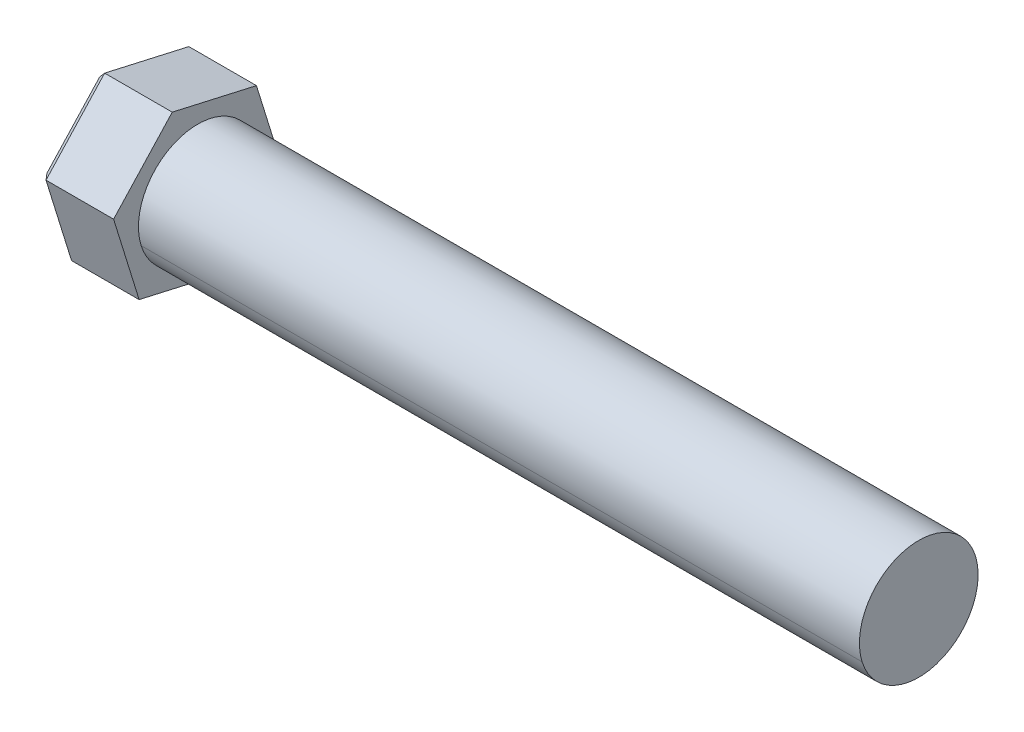
ISO-10303-21;
HEADER;
FILE_DESCRIPTION(('STEP AP214'),'2;1');
FILE_NAME('part.step','',(''),(''),'','','');
FILE_SCHEMA(('AUTOMOTIVE_DESIGN { 1 0 10303 214 1 1 1 1 }'));
ENDSEC;
DATA;
#1=APPLICATION_CONTEXT('core data for automotive mechanical design processes');
#2=APPLICATION_PROTOCOL_DEFINITION('international standard','automotive_design',2000,#1);
#3=PRODUCT_CONTEXT('',#1,'mechanical');
#4=PRODUCT('Part','Part','',(#3));
#5=PRODUCT_RELATED_PRODUCT_CATEGORY('part','',(#4));
#6=PRODUCT_DEFINITION_FORMATION('','',#4);
#7=PRODUCT_DEFINITION_CONTEXT('part definition',#1,'design');
#8=PRODUCT_DEFINITION('design','',#6,#7);
#9=PRODUCT_DEFINITION_SHAPE('','',#8);
#10=(LENGTH_UNIT() NAMED_UNIT(*) SI_UNIT(.MILLI.,.METRE.));
#11=(NAMED_UNIT(*) PLANE_ANGLE_UNIT() SI_UNIT($,.RADIAN.));
#12=(NAMED_UNIT(*) SI_UNIT($,.STERADIAN.) SOLID_ANGLE_UNIT());
#13=UNCERTAINTY_MEASURE_WITH_UNIT(LENGTH_MEASURE(1.E-05),#10,'distance_accuracy_value','');
#14=(GEOMETRIC_REPRESENTATION_CONTEXT(3) GLOBAL_UNCERTAINTY_ASSIGNED_CONTEXT((#13)) GLOBAL_UNIT_ASSIGNED_CONTEXT((#10,
#11,#12)) REPRESENTATION_CONTEXT('',''));
#15=CARTESIAN_POINT('',(0.,0.,0.));
#16=DIRECTION('',(0.,0.,1.));
#17=DIRECTION('',(1.,0.,0.));
#18=AXIS2_PLACEMENT_3D('',#15,#16,#17);
#19=CARTESIAN_POINT('',(-26.156988266467,-27.9977901596134,38.109837238925));
#20=DIRECTION('',(0.707106781186544,-0.689561283995948,0.156541482086585));
#21=DIRECTION('',(0.,-0.221383087040832,-0.97518691991447));
#22=AXIS2_PLACEMENT_3D('',#19,#20,#21);
#23=PLANE('',#22);
#24=DIRECTION('',(0.65465367070798,0.722084638574955,0.22365675970702));
#25=VECTOR('',#24,1.);
#26=CARTESIAN_POINT('',(-26.7966473512185,-28.1310269319542,40.4123090940544));
#27=LINE('',#26,#25);
#28=CARTESIAN_POINT('',(-26.156988266467,-27.4254813592478,40.6308430832672));
#29=VERTEX_POINT('',#28);
#30=CARTESIAN_POINT('',(-25.656988266467,-26.8739801068421,40.8016637551083));
#31=VERTEX_POINT('',#30);
#32=EDGE_CURVE('E25',#29,#31,#27,.T.);
#33=ORIENTED_EDGE('',*,*,#32,.T.);
#34=DIRECTION('',(0.,0.221383087040832,0.97518691991447));
#35=VECTOR('',#34,1.);
#36=CARTESIAN_POINT('',(-25.656988266467,-26.8739801068421,40.8016637551083));
#37=LINE('',#36,#35);
#38=CARTESIAN_POINT('',(-25.656988266467,-28.1464132924702,35.1966276357009));
#39=VERTEX_POINT('',#38);
#40=EDGE_CURVE('E219',#39,#31,#37,.T.);
#41=ORIENTED_EDGE('',*,*,#40,.F.);
#42=DIRECTION('',(-0.654653670707981,-0.554734754921868,0.513515260834907));
#43=VECTOR('',#42,1.);
#44=CARTESIAN_POINT('',(-26.7966473512185,-29.1121277325809,36.0905847894676));
#45=LINE('',#44,#43);
#46=CARTESIAN_POINT('',(-26.156988266467,-28.570098959979,35.5888313945827));
#47=VERTEX_POINT('',#46);
#48=EDGE_CURVE('E11',#39,#47,#45,.T.);
#49=ORIENTED_EDGE('',*,*,#48,.T.);
#50=DIRECTION('',(0.,-0.221383087040832,-0.97518691991447));
#51=VECTOR('',#50,1.);
#52=CARTESIAN_POINT('',(-26.156988266467,-27.9977901596134,38.109837238925));
#53=LINE('',#52,#51);
#54=EDGE_CURVE('E230',#29,#47,#53,.T.);
#55=ORIENTED_EDGE('',*,*,#54,.F.);
#56=EDGE_LOOP('',(#33,#41,#49,#55));
#57=FACE_BOUND('',#56,.T.);
#58=ADVANCED_FACE('F17',(#57),#23,.F.);
#59=CARTESIAN_POINT('',(-26.156988266467,-31.0395084644512,34.8239624323376));
#60=DIRECTION('',(0.707106781186544,-0.209211741764925,0.675448330449999));
#61=DIRECTION('',(0.,-0.955228189604648,-0.295870082611653));
#62=AXIS2_PLACEMENT_3D('',#59,#60,#61);
#63=PLANE('',#62);
#64=DIRECTION('',(-0.65465367070798,0.167349883653089,0.737172020541926));
#65=VECTOR('',#64,1.);
#66=CARTESIAN_POINT('',(-26.7966473512185,-33.345401168819,34.7793808541903));
#67=LINE('',#66,#65);
#68=CARTESIAN_POINT('',(-25.656988266467,-33.6367335538205,33.4960690393697));
#69=VERTEX_POINT('',#68);
#70=CARTESIAN_POINT('',(-26.156988266467,-33.5089179689234,34.0590934700924));
#71=VERTEX_POINT('',#70);
#72=EDGE_CURVE('E257',#69,#71,#67,.T.);
#73=ORIENTED_EDGE('',*,*,#72,.T.);
#74=DIRECTION('',(0.,-0.955228189604648,-0.295870082611653));
#75=VECTOR('',#74,1.);
#76=CARTESIAN_POINT('',(-26.156988266467,-31.0395084644512,34.8239624323376));
#77=LINE('',#76,#75);
#78=EDGE_CURVE('E234',#47,#71,#77,.T.);
#79=ORIENTED_EDGE('',*,*,#78,.F.);
#80=ORIENTED_EDGE('',*,*,#48,.F.);
#81=DIRECTION('',(0.,0.955228189604648,0.295870082611653));
#82=VECTOR('',#81,1.);
#83=CARTESIAN_POINT('',(-25.656988266467,-28.1464132924702,35.1966276357009));
#84=LINE('',#83,#82);
#85=EDGE_CURVE('E208',#69,#39,#84,.T.);
#86=ORIENTED_EDGE('',*,*,#85,.F.);
#87=EDGE_LOOP('',(#73,#79,#80,#86));
#88=FACE_BOUND('',#87,.T.);
#89=ADVANCED_FACE('F287',(#88),#63,.F.);
#90=CARTESIAN_POINT('',(-26.156988266467,-29.3225820633544,42.3869799653644));
#91=DIRECTION('',(0.707106781186545,-0.480349542231022,-0.518906848363414));
#92=DIRECTION('',(0.,-0.733845102563816,0.679316837302817));
#93=AXIS2_PLACEMENT_3D('',#90,#91,#92);
#94=PLANE('',#93);
#95=DIRECTION('',(0.65465367070798,0.167349883653088,0.737172020541926));
#96=VECTOR('',#95,1.);
#97=CARTESIAN_POINT('',(-26.7966473512185,-31.3831995675656,43.4228294633637));
#98=LINE('',#97,#96);
#99=CARTESIAN_POINT('',(-26.156988266467,-31.2196827674611,44.1431168474615));
#100=VERTEX_POINT('',#99);
#101=CARTESIAN_POINT('',(-25.656988266467,-31.091867182564,44.7061412781843));
#102=VERTEX_POINT('',#101);
#103=EDGE_CURVE('E254',#100,#102,#98,.T.);
#104=ORIENTED_EDGE('',*,*,#103,.T.);
#105=DIRECTION('',(0.,-0.733845102563816,0.679316837302817));
#106=VECTOR('',#105,1.);
#107=CARTESIAN_POINT('',(-25.656988266467,-31.091867182564,44.7061412781843));
#108=LINE('',#107,#106);
#109=EDGE_CURVE('E158',#31,#102,#108,.T.);
#110=ORIENTED_EDGE('',*,*,#109,.F.);
#111=ORIENTED_EDGE('',*,*,#32,.F.);
#112=DIRECTION('',(0.,0.733845102563816,-0.679316837302817));
#113=VECTOR('',#112,1.);
#114=CARTESIAN_POINT('',(-26.156988266467,-29.3225820633544,42.3869799653644));
#115=LINE('',#114,#113);
#116=EDGE_CURVE('E226',#100,#29,#115,.T.);
#117=ORIENTED_EDGE('',*,*,#116,.F.);
#118=EDGE_LOOP('',(#104,#110,#111,#117));
#119=FACE_BOUND('',#118,.T.);
#120=ADVANCED_FACE('F271',(#119),#94,.F.);
#121=CARTESIAN_POINT('',(-26.156988266467,-35.4060186730301,35.8152303521896));
#122=DIRECTION('',(0.707106781186545,0.480349542231022,0.518906848363414));
#123=DIRECTION('',(0.,-0.733845102563817,0.679316837302817));
#124=AXIS2_PLACEMENT_3D('',#121,#122,#123);
#125=PLANE('',#124);
#126=DIRECTION('',(-0.65465367070798,0.722084638574956,0.22365675970702));
#127=VECTOR('',#126,1.);
#128=CARTESIAN_POINT('',(-26.7966473512185,-36.5975738044303,37.7899012234996));
#129=LINE('',#128,#127);
#130=CARTESIAN_POINT('',(-25.656988266467,-37.8546206295425,37.4005465624457));
#131=VERTEX_POINT('',#130);
#132=CARTESIAN_POINT('',(-26.156988266467,-37.3031193771367,37.5713672342867));
#133=VERTEX_POINT('',#132);
#134=EDGE_CURVE('E46',#131,#133,#129,.T.);
#135=ORIENTED_EDGE('',*,*,#134,.T.);
#136=DIRECTION('',(0.,-0.733845102563816,0.679316837302817));
#137=VECTOR('',#136,1.);
#138=CARTESIAN_POINT('',(-26.156988266467,-35.4060186730301,35.8152303521896));
#139=LINE('',#138,#137);
#140=EDGE_CURVE('E238',#71,#133,#139,.T.);
#141=ORIENTED_EDGE('',*,*,#140,.F.);
#142=ORIENTED_EDGE('',*,*,#72,.F.);
#143=DIRECTION('',(0.,0.733845102563817,-0.679316837302817));
#144=VECTOR('',#143,1.);
#145=CARTESIAN_POINT('',(-25.656988266467,-33.6367335538205,33.4960690393697));
#146=LINE('',#145,#144);
#147=EDGE_CURVE('E197',#131,#69,#146,.T.);
#148=ORIENTED_EDGE('',*,*,#147,.F.);
#149=EDGE_LOOP('',(#135,#141,#142,#148));
#150=FACE_BOUND('',#149,.T.);
#151=ADVANCED_FACE('F300',(#150),#125,.F.);
#152=CARTESIAN_POINT('',(-26.156988266467,-33.6890922719333,43.3782478852163));
#153=DIRECTION('',(0.707106781186545,0.209211741764925,-0.675448330449999));
#154=DIRECTION('',(0.,-0.955228189604648,-0.295870082611653));
#155=AXIS2_PLACEMENT_3D('',#152,#153,#154);
#156=PLANE('',#155);
#157=DIRECTION('',(0.65465367070798,-0.554734754921869,0.513515260834906));
#158=VECTOR('',#157,1.);
#159=CARTESIAN_POINT('',(-26.7966473512185,-35.6164730038037,42.1116255280863));
#160=LINE('',#159,#158);
#161=CARTESIAN_POINT('',(-26.156988266467,-36.1585017764055,42.6133789229713));
#162=VERTEX_POINT('',#161);
#163=CARTESIAN_POINT('',(-25.656988266467,-36.5821874439143,43.0055826818531));
#164=VERTEX_POINT('',#163);
#165=EDGE_CURVE('E36',#162,#164,#160,.T.);
#166=ORIENTED_EDGE('',*,*,#165,.T.);
#167=DIRECTION('',(0.,-0.955228189604648,-0.295870082611653));
#168=VECTOR('',#167,1.);
#169=CARTESIAN_POINT('',(-25.656988266467,-36.5821874439143,43.0055826818531));
#170=LINE('',#169,#168);
#171=EDGE_CURVE('E165',#102,#164,#170,.T.);
#172=ORIENTED_EDGE('',*,*,#171,.F.);
#173=ORIENTED_EDGE('',*,*,#103,.F.);
#174=DIRECTION('',(0.,0.955228189604648,0.295870082611653));
#175=VECTOR('',#174,1.);
#176=CARTESIAN_POINT('',(-26.156988266467,-33.6890922719333,43.3782478852163));
#177=LINE('',#176,#175);
#178=EDGE_CURVE('E246',#162,#100,#177,.T.);
#179=ORIENTED_EDGE('',*,*,#178,.F.);
#180=EDGE_LOOP('',(#166,#172,#173,#179));
#181=FACE_BOUND('',#180,.T.);
#182=ADVANCED_FACE('F292',(#181),#156,.F.);
#183=CARTESIAN_POINT('',(-26.156988266467,-36.7308105767711,40.092373078629));
#184=DIRECTION('',(0.707106781186545,0.689561283995947,-0.156541482086584));
#185=DIRECTION('',(0.,-0.221383087040832,-0.97518691991447));
#186=AXIS2_PLACEMENT_3D('',#183,#184,#185);
#187=PLANE('',#186);
#188=ORIENTED_EDGE('',*,*,#134,.F.);
#189=DIRECTION('',(0.,-0.221383087040832,-0.97518691991447));
#190=VECTOR('',#189,1.);
#191=CARTESIAN_POINT('',(-25.656988266467,-37.8546206295425,37.4005465624457));
#192=LINE('',#191,#190);
#193=EDGE_CURVE('E186',#164,#131,#192,.T.);
#194=ORIENTED_EDGE('',*,*,#193,.F.);
#195=ORIENTED_EDGE('',*,*,#165,.F.);
#196=DIRECTION('',(0.,0.221383087040832,0.97518691991447));
#197=VECTOR('',#196,1.);
#198=CARTESIAN_POINT('',(-26.156988266467,-36.7308105767711,40.092373078629));
#199=LINE('',#198,#197);
#200=EDGE_CURVE('E242',#133,#162,#199,.T.);
#201=ORIENTED_EDGE('',*,*,#200,.F.);
#202=EDGE_LOOP('',(#188,#194,#195,#201));
#203=FACE_BOUND('',#202,.T.);
#204=ADVANCED_FACE('F308',(#203),#187,.F.);
#205=CARTESIAN_POINT('',(-26.156988266467,-32.3643003681923,39.101105158777));
#206=DIRECTION('',(-1.,0.,0.));
#207=DIRECTION('',(0.,0.,1.));
#208=AXIS2_PLACEMENT_3D('',#205,#206,#207);
#209=PLANE('',#208);
#210=ORIENTED_EDGE('',*,*,#116,.T.);
#211=ORIENTED_EDGE('',*,*,#54,.T.);
#212=ORIENTED_EDGE('',*,*,#78,.T.);
#213=ORIENTED_EDGE('',*,*,#140,.T.);
#214=ORIENTED_EDGE('',*,*,#200,.T.);
#215=ORIENTED_EDGE('',*,*,#178,.T.);
#216=EDGE_LOOP('',(#210,#211,#212,#213,#214,#215));
#217=FACE_BOUND('',#216,.T.);
#218=ADVANCED_FACE('F290',(#217),#209,.T.);
#219=CARTESIAN_POINT('',(-21.156988266467,-32.3643003681923,39.101105158777));
#220=DIRECTION('',(-1.,0.,0.));
#221=DIRECTION('',(0.,0.,1.));
#222=AXIS2_PLACEMENT_3D('',#219,#220,#221);
#223=PLANE('',#222);
#224=CARTESIAN_POINT('',(-21.156988266467,-32.3643003681923,39.101105158777));
#225=DIRECTION('',(-1.,0.,0.));
#226=DIRECTION('',(0.,-0.295870082611653,0.955228189604648));
#227=AXIS2_PLACEMENT_3D('',#224,#225,#226);
#228=CIRCLE('',#227,3.95);
#229=CARTESIAN_POINT('',(-21.156988266467,-31.1956135418762,35.3279538098386));
#230=VERTEX_POINT('',#229);
#231=CARTESIAN_POINT('',(-21.156988266467,-33.5329871945083,42.8742565077154));
#232=VERTEX_POINT('',#231);
#233=EDGE_CURVE('E126',#230,#232,#228,.T.);
#234=ORIENTED_EDGE('',*,*,#233,.T.);
#235=CARTESIAN_POINT('',(-21.156988266467,-32.3643003681923,39.101105158777));
#236=DIRECTION('',(-1.,0.,0.));
#237=DIRECTION('',(0.,-0.295870082611653,0.955228189604648));
#238=AXIS2_PLACEMENT_3D('',#235,#236,#237);
#239=CIRCLE('',#238,3.95);
#240=EDGE_CURVE('E131',#232,#230,#239,.T.);
#241=ORIENTED_EDGE('',*,*,#240,.T.);
#242=EDGE_LOOP('',(#234,#241));
#243=FACE_BOUND('',#242,.T.);
#244=DIRECTION('',(0.,0.733845102563816,-0.679316837302817));
#245=VECTOR('',#244,1.);
#246=CARTESIAN_POINT('',(-21.156988266467,-31.091867182564,44.7061412781843));
#247=LINE('',#246,#245);
#248=CARTESIAN_POINT('',(-21.156988266467,-31.091867182564,44.7061412781843));
#249=VERTEX_POINT('',#248);
#250=CARTESIAN_POINT('',(-21.156988266467,-26.8739801068421,40.8016637551083));
#251=VERTEX_POINT('',#250);
#252=EDGE_CURVE('E157',#249,#251,#247,.T.);
#253=ORIENTED_EDGE('',*,*,#252,.F.);
#254=DIRECTION('',(0.,0.955228189604648,0.295870082611653));
#255=VECTOR('',#254,1.);
#256=CARTESIAN_POINT('',(-21.156988266467,-36.5821874439143,43.0055826818531));
#257=LINE('',#256,#255);
#258=CARTESIAN_POINT('',(-21.156988266467,-36.5821874439143,43.0055826818531));
#259=VERTEX_POINT('',#258);
#260=EDGE_CURVE('E173',#259,#249,#257,.T.);
#261=ORIENTED_EDGE('',*,*,#260,.F.);
#262=DIRECTION('',(0.,0.221383087040832,0.97518691991447));
#263=VECTOR('',#262,1.);
#264=CARTESIAN_POINT('',(-21.156988266467,-37.8546206295425,37.4005465624457));
#265=LINE('',#264,#263);
#266=CARTESIAN_POINT('',(-21.156988266467,-37.8546206295425,37.4005465624457));
#267=VERTEX_POINT('',#266);
#268=EDGE_CURVE('E194',#267,#259,#265,.T.);
#269=ORIENTED_EDGE('',*,*,#268,.F.);
#270=DIRECTION('',(0.,-0.733845102563816,0.679316837302817));
#271=VECTOR('',#270,1.);
#272=CARTESIAN_POINT('',(-21.156988266467,-33.6367335538205,33.4960690393697));
#273=LINE('',#272,#271);
#274=CARTESIAN_POINT('',(-21.156988266467,-33.6367335538205,33.4960690393697));
#275=VERTEX_POINT('',#274);
#276=EDGE_CURVE('E205',#275,#267,#273,.T.);
#277=ORIENTED_EDGE('',*,*,#276,.F.);
#278=DIRECTION('',(0.,-0.955228189604648,-0.295870082611653));
#279=VECTOR('',#278,1.);
#280=CARTESIAN_POINT('',(-21.156988266467,-28.1464132924702,35.1966276357009));
#281=LINE('',#280,#279);
#282=CARTESIAN_POINT('',(-21.156988266467,-28.1464132924702,35.1966276357009));
#283=VERTEX_POINT('',#282);
#284=EDGE_CURVE('E216',#283,#275,#281,.T.);
#285=ORIENTED_EDGE('',*,*,#284,.F.);
#286=DIRECTION('',(0.,-0.221383087040832,-0.97518691991447));
#287=VECTOR('',#286,1.);
#288=CARTESIAN_POINT('',(-21.156988266467,-26.8739801068421,40.8016637551083));
#289=LINE('',#288,#287);
#290=EDGE_CURVE('E223',#251,#283,#289,.T.);
#291=ORIENTED_EDGE('',*,*,#290,.F.);
#292=EDGE_LOOP('',(#253,#261,#269,#277,#285,#291));
#293=FACE_BOUND('',#292,.T.);
#294=ADVANCED_FACE('F128',(#243,#293),#223,.F.);
#295=CARTESIAN_POINT('',(-21.156988266467,-26.8739801068421,40.8016637551083));
#296=DIRECTION('',(0.,0.97518691991447,-0.221383087040832));
#297=DIRECTION('',(-1.,0.,0.));
#298=AXIS2_PLACEMENT_3D('',#295,#296,#297);
#299=PLANE('',#298);
#300=DIRECTION('',(-1.,0.,0.));
#301=VECTOR('',#300,1.);
#302=CARTESIAN_POINT('',(-21.156988266467,-28.1464132924702,35.1966276357009));
#303=LINE('',#302,#301);
#304=EDGE_CURVE('E212',#283,#39,#303,.T.);
#305=ORIENTED_EDGE('',*,*,#304,.T.);
#306=ORIENTED_EDGE('',*,*,#40,.T.);
#307=DIRECTION('',(-1.,0.,0.));
#308=VECTOR('',#307,1.);
#309=CARTESIAN_POINT('',(-21.156988266467,-26.8739801068421,40.8016637551083));
#310=LINE('',#309,#308);
#311=EDGE_CURVE('E160',#251,#31,#310,.T.);
#312=ORIENTED_EDGE('',*,*,#311,.F.);
#313=ORIENTED_EDGE('',*,*,#290,.T.);
#314=EDGE_LOOP('',(#305,#306,#312,#313));
#315=FACE_BOUND('',#314,.T.);
#316=ADVANCED_FACE('F269',(#315),#299,.T.);
#317=CARTESIAN_POINT('',(-21.156988266467,-28.1464132924702,35.1966276357009));
#318=DIRECTION('',(0.,0.295870082611653,-0.955228189604648));
#319=DIRECTION('',(-1.,0.,0.));
#320=AXIS2_PLACEMENT_3D('',#317,#318,#319);
#321=PLANE('',#320);
#322=DIRECTION('',(-1.,0.,0.));
#323=VECTOR('',#322,1.);
#324=CARTESIAN_POINT('',(-21.156988266467,-33.6367335538205,33.4960690393697));
#325=LINE('',#324,#323);
#326=EDGE_CURVE('E201',#275,#69,#325,.T.);
#327=ORIENTED_EDGE('',*,*,#326,.T.);
#328=ORIENTED_EDGE('',*,*,#85,.T.);
#329=ORIENTED_EDGE('',*,*,#304,.F.);
#330=ORIENTED_EDGE('',*,*,#284,.T.);
#331=EDGE_LOOP('',(#327,#328,#329,#330));
#332=FACE_BOUND('',#331,.T.);
#333=ADVANCED_FACE('F284',(#332),#321,.T.);
#334=CARTESIAN_POINT('',(-21.156988266467,-33.6367335538205,33.4960690393697));
#335=DIRECTION('',(0.,-0.679316837302817,-0.733845102563816));
#336=DIRECTION('',(0.,-0.733845102563817,0.679316837302817));
#337=AXIS2_PLACEMENT_3D('',#334,#335,#336);
#338=PLANE('',#337);
#339=DIRECTION('',(-1.,0.,0.));
#340=VECTOR('',#339,1.);
#341=CARTESIAN_POINT('',(-21.156988266467,-37.8546206295425,37.4005465624457));
#342=LINE('',#341,#340);
#343=EDGE_CURVE('E190',#267,#131,#342,.T.);
#344=ORIENTED_EDGE('',*,*,#343,.T.);
#345=ORIENTED_EDGE('',*,*,#147,.T.);
#346=ORIENTED_EDGE('',*,*,#326,.F.);
#347=ORIENTED_EDGE('',*,*,#276,.T.);
#348=EDGE_LOOP('',(#344,#345,#346,#347));
#349=FACE_BOUND('',#348,.T.);
#350=ADVANCED_FACE('F299',(#349),#338,.T.);
#351=CARTESIAN_POINT('',(-21.156988266467,-37.8546206295425,37.4005465624457));
#352=DIRECTION('',(0.,-0.97518691991447,0.221383087040832));
#353=DIRECTION('',(-1.,0.,0.));
#354=AXIS2_PLACEMENT_3D('',#351,#352,#353);
#355=PLANE('',#354);
#356=DIRECTION('',(-1.,0.,0.));
#357=VECTOR('',#356,1.);
#358=CARTESIAN_POINT('',(-21.156988266467,-36.5821874439143,43.0055826818531));
#359=LINE('',#358,#357);
#360=EDGE_CURVE('E170',#259,#164,#359,.T.);
#361=ORIENTED_EDGE('',*,*,#360,.T.);
#362=ORIENTED_EDGE('',*,*,#193,.T.);
#363=ORIENTED_EDGE('',*,*,#343,.F.);
#364=ORIENTED_EDGE('',*,*,#268,.T.);
#365=EDGE_LOOP('',(#361,#362,#363,#364));
#366=FACE_BOUND('',#365,.T.);
#367=ADVANCED_FACE('F296',(#366),#355,.T.);
#368=CARTESIAN_POINT('',(-21.156988266467,-36.5821874439143,43.0055826818531));
#369=DIRECTION('',(0.,-0.295870082611653,0.955228189604648));
#370=DIRECTION('',(-1.,0.,0.));
#371=AXIS2_PLACEMENT_3D('',#368,#369,#370);
#372=PLANE('',#371);
#373=DIRECTION('',(-1.,0.,0.));
#374=VECTOR('',#373,1.);
#375=CARTESIAN_POINT('',(-21.156988266467,-31.091867182564,44.7061412781843));
#376=LINE('',#375,#374);
#377=EDGE_CURVE('E154',#249,#102,#376,.T.);
#378=ORIENTED_EDGE('',*,*,#377,.T.);
#379=ORIENTED_EDGE('',*,*,#171,.T.);
#380=ORIENTED_EDGE('',*,*,#360,.F.);
#381=ORIENTED_EDGE('',*,*,#260,.T.);
#382=EDGE_LOOP('',(#378,#379,#380,#381));
#383=FACE_BOUND('',#382,.T.);
#384=ADVANCED_FACE('F294',(#383),#372,.T.);
#385=CARTESIAN_POINT('',(-21.156988266467,-31.091867182564,44.7061412781843));
#386=DIRECTION('',(0.,0.679316837302817,0.733845102563816));
#387=DIRECTION('',(1.,0.,0.));
#388=AXIS2_PLACEMENT_3D('',#385,#386,#387);
#389=PLANE('',#388);
#390=ORIENTED_EDGE('',*,*,#311,.T.);
#391=ORIENTED_EDGE('',*,*,#109,.T.);
#392=ORIENTED_EDGE('',*,*,#377,.F.);
#393=ORIENTED_EDGE('',*,*,#252,.T.);
#394=EDGE_LOOP('',(#390,#391,#392,#393));
#395=FACE_BOUND('',#394,.T.);
#396=ADVANCED_FACE('F275',(#395),#389,.T.);
#397=CARTESIAN_POINT('',(26.843011733533,-32.3643003681923,39.101105158777));
#398=DIRECTION('',(-1.,0.,0.));
#399=DIRECTION('',(0.,0.,1.));
#400=AXIS2_PLACEMENT_3D('',#397,#398,#399);
#401=PLANE('',#400);
#402=CARTESIAN_POINT('',(26.843011733533,-32.3643003681923,39.101105158777));
#403=DIRECTION('',(-1.,0.,0.));
#404=DIRECTION('',(0.,-0.295870082611653,0.955228189604648));
#405=AXIS2_PLACEMENT_3D('',#402,#403,#404);
#406=CIRCLE('',#405,3.95);
#407=CARTESIAN_POINT('',(26.843011733533,-31.1956135418762,35.3279538098386));
#408=VERTEX_POINT('',#407);
#409=CARTESIAN_POINT('',(26.843011733533,-33.5329871945083,42.8742565077154));
#410=VERTEX_POINT('',#409);
#411=EDGE_CURVE('E136',#408,#410,#406,.T.);
#412=ORIENTED_EDGE('',*,*,#411,.F.);
#413=CARTESIAN_POINT('',(26.843011733533,-32.3643003681923,39.101105158777));
#414=DIRECTION('',(-1.,0.,0.));
#415=DIRECTION('',(0.,-0.295870082611653,0.955228189604648));
#416=AXIS2_PLACEMENT_3D('',#413,#414,#415);
#417=CIRCLE('',#416,3.95);
#418=EDGE_CURVE('E146',#410,#408,#417,.T.);
#419=ORIENTED_EDGE('',*,*,#418,.F.);
#420=EDGE_LOOP('',(#412,#419));
#421=FACE_BOUND('',#420,.T.);
#422=ADVANCED_FACE('F375',(#421),#401,.F.);
#423=CARTESIAN_POINT('',(-26.156988266467,-32.3643003681923,39.101105158777));
#424=DIRECTION('',(1.,0.,0.));
#425=DIRECTION('',(0.,0.295870082611653,-0.955228189604648));
#426=AXIS2_PLACEMENT_3D('',#423,#424,#425);
#427=CYLINDRICAL_SURFACE('',#426,3.95);
#428=DIRECTION('',(1.,0.,0.));
#429=VECTOR('',#428,1.);
#430=CARTESIAN_POINT('',(-26.156988266467,-33.5329871945083,42.8742565077154));
#431=LINE('',#430,#429);
#432=EDGE_CURVE('E140',#232,#410,#431,.T.);
#433=ORIENTED_EDGE('',*,*,#432,.F.);
#434=ORIENTED_EDGE('',*,*,#233,.F.);
#435=DIRECTION('',(1.,0.,0.));
#436=VECTOR('',#435,1.);
#437=CARTESIAN_POINT('',(-26.156988266467,-31.1956135418762,35.3279538098386));
#438=LINE('',#437,#436);
#439=EDGE_CURVE('E137',#230,#408,#438,.T.);
#440=ORIENTED_EDGE('',*,*,#439,.T.);
#441=ORIENTED_EDGE('',*,*,#411,.T.);
#442=EDGE_LOOP('',(#433,#434,#440,#441));
#443=FACE_BOUND('',#442,.T.);
#444=ADVANCED_FACE('F141',(#443),#427,.T.);
#445=CARTESIAN_POINT('',(-26.156988266467,-32.3643003681923,39.101105158777));
#446=DIRECTION('',(1.,0.,0.));
#447=DIRECTION('',(0.,0.295870082611653,-0.955228189604648));
#448=AXIS2_PLACEMENT_3D('',#445,#446,#447);
#449=CYLINDRICAL_SURFACE('',#448,3.95);
#450=ORIENTED_EDGE('',*,*,#240,.F.);
#451=ORIENTED_EDGE('',*,*,#432,.T.);
#452=ORIENTED_EDGE('',*,*,#418,.T.);
#453=ORIENTED_EDGE('',*,*,#439,.F.);
#454=EDGE_LOOP('',(#450,#451,#452,#453));
#455=FACE_BOUND('',#454,.T.);
#456=ADVANCED_FACE('F148',(#455),#449,.T.);
#457=CLOSED_SHELL('',(#58,#89,#120,#151,#182,#204,#218,#294,#316,#333,#350,#367,#384,#396,#422,
#444,#456));
#458=MANIFOLD_SOLID_BREP('B1',#457);
#459=ADVANCED_BREP_SHAPE_REPRESENTATION('',(#18,#458),#14);
#460=SHAPE_DEFINITION_REPRESENTATION(#9,#459);
ENDSEC;
END-ISO-10303-21;
